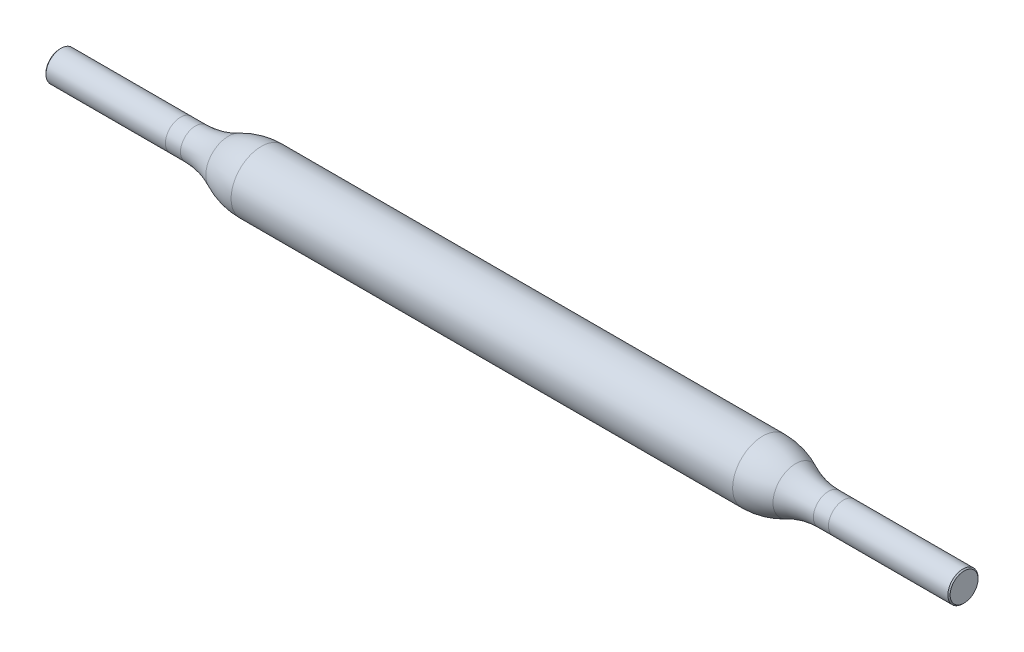
ISO-10303-21;
HEADER;
FILE_DESCRIPTION(('STEP AP214'),'2;1');
FILE_NAME('part.step','',(''),(''),'','','');
FILE_SCHEMA(('AUTOMOTIVE_DESIGN { 1 0 10303 214 1 1 1 1 }'));
ENDSEC;
DATA;
#1=APPLICATION_CONTEXT('core data for automotive mechanical design processes');
#2=APPLICATION_PROTOCOL_DEFINITION('international standard','automotive_design',2000,#1);
#3=PRODUCT_CONTEXT('',#1,'mechanical');
#4=PRODUCT('Part','Part','',(#3));
#5=PRODUCT_RELATED_PRODUCT_CATEGORY('part','',(#4));
#6=PRODUCT_DEFINITION_FORMATION('','',#4);
#7=PRODUCT_DEFINITION_CONTEXT('part definition',#1,'design');
#8=PRODUCT_DEFINITION('design','',#6,#7);
#9=PRODUCT_DEFINITION_SHAPE('','',#8);
#10=(LENGTH_UNIT() NAMED_UNIT(*) SI_UNIT(.MILLI.,.METRE.));
#11=(NAMED_UNIT(*) PLANE_ANGLE_UNIT() SI_UNIT($,.RADIAN.));
#12=(NAMED_UNIT(*) SI_UNIT($,.STERADIAN.) SOLID_ANGLE_UNIT());
#13=UNCERTAINTY_MEASURE_WITH_UNIT(LENGTH_MEASURE(1.E-05),#10,'distance_accuracy_value','');
#14=(GEOMETRIC_REPRESENTATION_CONTEXT(3) GLOBAL_UNCERTAINTY_ASSIGNED_CONTEXT((#13)) GLOBAL_UNIT_ASSIGNED_CONTEXT((#10,
#11,#12)) REPRESENTATION_CONTEXT('',''));
#15=CARTESIAN_POINT('',(0.,0.,0.));
#16=DIRECTION('',(0.,0.,1.));
#17=DIRECTION('',(1.,0.,0.));
#18=AXIS2_PLACEMENT_3D('',#15,#16,#17);
#19=CARTESIAN_POINT('',(-30.,0.,0.));
#20=DIRECTION('',(-1.,0.,0.));
#21=DIRECTION('',(0.,0.,1.));
#22=AXIS2_PLACEMENT_3D('',#19,#20,#21);
#23=CYLINDRICAL_SURFACE('',#22,1.);
#24=CARTESIAN_POINT('',(21.,0.,0.));
#25=DIRECTION('',(-1.,0.,0.));
#26=DIRECTION('',(0.,0.,1.));
#27=AXIS2_PLACEMENT_3D('',#24,#25,#26);
#28=CIRCLE('',#27,1.);
#29=CARTESIAN_POINT('',(21.,0.,1.));
#30=VERTEX_POINT('',#29);
#31=EDGE_CURVE('E74',#30,#30,#28,.T.);
#32=ORIENTED_EDGE('',*,*,#31,.F.);
#33=EDGE_LOOP('',(#32));
#34=FACE_BOUND('',#33,.T.);
#35=CARTESIAN_POINT('',(22.,0.,0.));
#36=DIRECTION('',(1.,0.,0.));
#37=DIRECTION('',(0.,0.,-1.));
#38=AXIS2_PLACEMENT_3D('',#35,#36,#37);
#39=CIRCLE('',#38,1.);
#40=CARTESIAN_POINT('',(22.,0.,-1.));
#41=VERTEX_POINT('',#40);
#42=EDGE_CURVE('E66',#41,#41,#39,.T.);
#43=ORIENTED_EDGE('',*,*,#42,.F.);
#44=EDGE_LOOP('',(#43));
#45=FACE_BOUND('',#44,.T.);
#46=ADVANCED_FACE('F45',(#34,#45),#23,.T.);
#47=CARTESIAN_POINT('',(-30.,0.,0.));
#48=DIRECTION('',(-1.,0.,0.));
#49=DIRECTION('',(0.,0.,1.));
#50=AXIS2_PLACEMENT_3D('',#47,#48,#49);
#51=CYLINDRICAL_SURFACE('',#50,1.);
#52=CARTESIAN_POINT('',(-29.925,0.,0.));
#53=DIRECTION('',(1.,0.,0.));
#54=DIRECTION('',(0.,0.,-1.));
#55=AXIS2_PLACEMENT_3D('',#52,#53,#54);
#56=CIRCLE('',#55,1.);
#57=CARTESIAN_POINT('',(-29.925,0.,-1.));
#58=VERTEX_POINT('',#57);
#59=EDGE_CURVE('E57',#58,#58,#56,.T.);
#60=ORIENTED_EDGE('',*,*,#59,.T.);
#61=EDGE_LOOP('',(#60));
#62=FACE_BOUND('',#61,.T.);
#63=CARTESIAN_POINT('',(-22.,0.,0.));
#64=DIRECTION('',(1.,0.,0.));
#65=DIRECTION('',(0.,0.,-1.));
#66=AXIS2_PLACEMENT_3D('',#63,#64,#65);
#67=CIRCLE('',#66,1.);
#68=CARTESIAN_POINT('',(-22.,0.,-1.));
#69=VERTEX_POINT('',#68);
#70=EDGE_CURVE('E70',#69,#69,#67,.T.);
#71=ORIENTED_EDGE('',*,*,#70,.F.);
#72=EDGE_LOOP('',(#71));
#73=FACE_BOUND('',#72,.T.);
#74=ADVANCED_FACE('F128',(#62,#73),#51,.T.);
#75=CARTESIAN_POINT('',(-30.,0.,0.));
#76=DIRECTION('',(1.,0.,0.));
#77=DIRECTION('',(0.,0.,-1.));
#78=AXIS2_PLACEMENT_3D('',#75,#76,#77);
#79=PLANE('',#78);
#80=CARTESIAN_POINT('',(-30.,0.,0.));
#81=DIRECTION('',(1.,0.,0.));
#82=DIRECTION('',(0.,0.,-1.));
#83=AXIS2_PLACEMENT_3D('',#80,#81,#82);
#84=CIRCLE('',#83,0.924999999999995);
#85=CARTESIAN_POINT('',(-30.,0.,-0.924999999999995));
#86=VERTEX_POINT('',#85);
#87=EDGE_CURVE('E61',#86,#86,#84,.F.);
#88=ORIENTED_EDGE('',*,*,#87,.T.);
#89=EDGE_LOOP('',(#88));
#90=FACE_BOUND('',#89,.T.);
#91=ADVANCED_FACE('F137',(#90),#79,.F.);
#92=CARTESIAN_POINT('',(30.,0.,0.));
#93=DIRECTION('',(-1.,0.,0.));
#94=DIRECTION('',(0.,0.,1.));
#95=AXIS2_PLACEMENT_3D('',#92,#93,#94);
#96=PLANE('',#95);
#97=CARTESIAN_POINT('',(30.,0.,0.));
#98=DIRECTION('',(-1.,0.,0.));
#99=DIRECTION('',(0.,0.,1.));
#100=AXIS2_PLACEMENT_3D('',#97,#98,#99);
#101=CIRCLE('',#100,0.925000000000002);
#102=CARTESIAN_POINT('',(30.,0.,0.925000000000002));
#103=VERTEX_POINT('',#102);
#104=EDGE_CURVE('E10',#103,#103,#101,.F.);
#105=ORIENTED_EDGE('',*,*,#104,.T.);
#106=EDGE_LOOP('',(#105));
#107=FACE_BOUND('',#106,.T.);
#108=ADVANCED_FACE('F133',(#107),#96,.F.);
#109=CARTESIAN_POINT('',(29.925,0.,0.));
#110=DIRECTION('',(-1.,0.,0.));
#111=DIRECTION('',(0.,0.,1.));
#112=AXIS2_PLACEMENT_3D('',#109,#110,#111);
#113=CIRCLE('',#112,1.);
#114=CARTESIAN_POINT('',(29.925,0.,1.));
#115=VERTEX_POINT('',#114);
#116=EDGE_CURVE('E53',#115,#115,#113,.T.);
#117=ORIENTED_EDGE('',*,*,#116,.T.);
#118=EDGE_LOOP('',(#117));
#119=FACE_BOUND('',#118,.T.);
#120=ORIENTED_EDGE('',*,*,#42,.T.);
#121=EDGE_LOOP('',(#120));
#122=FACE_BOUND('',#121,.T.);
#123=ADVANCED_FACE('F122',(#119,#122),#23,.T.);
#124=CARTESIAN_POINT('',(21.,0.,0.));
#125=DIRECTION('',(-1.,0.,0.));
#126=DIRECTION('',(0.,0.,1.));
#127=AXIS2_PLACEMENT_3D('',#124,#125,#126);
#128=TOROIDAL_SURFACE('',#127,6.,5.);
#129=CARTESIAN_POINT('',(18.8205505282297,0.,0.));
#130=DIRECTION('',(-1.,0.,0.));
#131=DIRECTION('',(0.,0.,1.));
#132=AXIS2_PLACEMENT_3D('',#129,#130,#131);
#133=CIRCLE('',#132,1.5);
#134=CARTESIAN_POINT('',(18.8205505282297,0.,1.5));
#135=VERTEX_POINT('',#134);
#136=EDGE_CURVE('E77',#135,#135,#133,.T.);
#137=ORIENTED_EDGE('',*,*,#136,.F.);
#138=EDGE_LOOP('',(#137));
#139=FACE_BOUND('',#138,.T.);
#140=ORIENTED_EDGE('',*,*,#31,.T.);
#141=EDGE_LOOP('',(#140));
#142=FACE_BOUND('',#141,.T.);
#143=ADVANCED_FACE('F116',(#139,#142),#128,.F.);
#144=CARTESIAN_POINT('',(16.6411010564593,0.,0.));
#145=DIRECTION('',(-1.,0.,0.));
#146=DIRECTION('',(0.,0.,1.));
#147=AXIS2_PLACEMENT_3D('',#144,#145,#146);
#148=DEGENERATE_TOROIDAL_SURFACE('',#147,3.,5.,.F.);
#149=CARTESIAN_POINT('',(16.6411010564593,0.,0.));
#150=DIRECTION('',(-1.,0.,0.));
#151=DIRECTION('',(0.,0.,1.));
#152=AXIS2_PLACEMENT_3D('',#149,#150,#151);
#153=CIRCLE('',#152,2.);
#154=CARTESIAN_POINT('',(16.6411010564593,0.,2.));
#155=VERTEX_POINT('',#154);
#156=EDGE_CURVE('E80',#155,#155,#153,.T.);
#157=ORIENTED_EDGE('',*,*,#156,.F.);
#158=EDGE_LOOP('',(#157));
#159=FACE_BOUND('',#158,.T.);
#160=ORIENTED_EDGE('',*,*,#136,.T.);
#161=EDGE_LOOP('',(#160));
#162=FACE_BOUND('',#161,.T.);
#163=ADVANCED_FACE('F110',(#159,#162),#148,.F.);
#164=CARTESIAN_POINT('',(-30.,0.,0.));
#165=DIRECTION('',(-1.,0.,0.));
#166=DIRECTION('',(0.,0.,1.));
#167=AXIS2_PLACEMENT_3D('',#164,#165,#166);
#168=CYLINDRICAL_SURFACE('',#167,2.);
#169=CARTESIAN_POINT('',(-16.6411010564593,0.,0.));
#170=DIRECTION('',(-1.,0.,0.));
#171=DIRECTION('',(0.,0.,1.));
#172=AXIS2_PLACEMENT_3D('',#169,#170,#171);
#173=CIRCLE('',#172,2.);
#174=CARTESIAN_POINT('',(-16.6411010564593,0.,2.));
#175=VERTEX_POINT('',#174);
#176=EDGE_CURVE('E83',#175,#175,#173,.T.);
#177=ORIENTED_EDGE('',*,*,#176,.F.);
#178=EDGE_LOOP('',(#177));
#179=FACE_BOUND('',#178,.T.);
#180=ORIENTED_EDGE('',*,*,#156,.T.);
#181=EDGE_LOOP('',(#180));
#182=FACE_BOUND('',#181,.T.);
#183=ADVANCED_FACE('F104',(#179,#182),#168,.T.);
#184=CARTESIAN_POINT('',(-16.6411010564593,0.,0.));
#185=DIRECTION('',(-1.,0.,0.));
#186=DIRECTION('',(0.,0.,1.));
#187=AXIS2_PLACEMENT_3D('',#184,#185,#186);
#188=DEGENERATE_TOROIDAL_SURFACE('',#187,3.,5.,.F.);
#189=CARTESIAN_POINT('',(-18.8205505282297,0.,0.));
#190=DIRECTION('',(-1.,0.,0.));
#191=DIRECTION('',(0.,0.,1.));
#192=AXIS2_PLACEMENT_3D('',#189,#190,#191);
#193=CIRCLE('',#192,1.5);
#194=CARTESIAN_POINT('',(-18.8205505282297,0.,1.5));
#195=VERTEX_POINT('',#194);
#196=EDGE_CURVE('E86',#195,#195,#193,.T.);
#197=ORIENTED_EDGE('',*,*,#196,.F.);
#198=EDGE_LOOP('',(#197));
#199=FACE_BOUND('',#198,.T.);
#200=ORIENTED_EDGE('',*,*,#176,.T.);
#201=EDGE_LOOP('',(#200));
#202=FACE_BOUND('',#201,.T.);
#203=ADVANCED_FACE('F98',(#199,#202),#188,.F.);
#204=CARTESIAN_POINT('',(-21.,0.,0.));
#205=DIRECTION('',(-1.,0.,0.));
#206=DIRECTION('',(0.,0.,1.));
#207=AXIS2_PLACEMENT_3D('',#204,#205,#206);
#208=TOROIDAL_SURFACE('',#207,6.,5.);
#209=CARTESIAN_POINT('',(-21.,0.,0.));
#210=DIRECTION('',(-1.,0.,0.));
#211=DIRECTION('',(0.,0.,1.));
#212=AXIS2_PLACEMENT_3D('',#209,#210,#211);
#213=CIRCLE('',#212,1.);
#214=CARTESIAN_POINT('',(-21.,0.,1.));
#215=VERTEX_POINT('',#214);
#216=EDGE_CURVE('E89',#215,#215,#213,.T.);
#217=ORIENTED_EDGE('',*,*,#216,.F.);
#218=EDGE_LOOP('',(#217));
#219=FACE_BOUND('',#218,.T.);
#220=ORIENTED_EDGE('',*,*,#196,.T.);
#221=EDGE_LOOP('',(#220));
#222=FACE_BOUND('',#221,.T.);
#223=ADVANCED_FACE('F95',(#219,#222),#208,.F.);
#224=ORIENTED_EDGE('',*,*,#70,.T.);
#225=EDGE_LOOP('',(#224));
#226=FACE_BOUND('',#225,.T.);
#227=ORIENTED_EDGE('',*,*,#216,.T.);
#228=EDGE_LOOP('',(#227));
#229=FACE_BOUND('',#228,.T.);
#230=ADVANCED_FACE('F93',(#226,#229),#51,.T.);
#231=CARTESIAN_POINT('',(-30.,0.,0.));
#232=DIRECTION('',(1.,0.,0.));
#233=DIRECTION('',(0.,0.,-1.));
#234=AXIS2_PLACEMENT_3D('',#231,#232,#233);
#235=CONICAL_SURFACE('',#234,0.924999999999995,0.785398163397492);
#236=ORIENTED_EDGE('',*,*,#59,.F.);
#237=EDGE_LOOP('',(#236));
#238=FACE_BOUND('',#237,.T.);
#239=ORIENTED_EDGE('',*,*,#87,.F.);
#240=EDGE_LOOP('',(#239));
#241=FACE_BOUND('',#240,.T.);
#242=ADVANCED_FACE('F143',(#238,#241),#235,.T.);
#243=CARTESIAN_POINT('',(29.925,0.,0.));
#244=DIRECTION('',(-1.,0.,0.));
#245=DIRECTION('',(0.,0.,1.));
#246=AXIS2_PLACEMENT_3D('',#243,#244,#245);
#247=CONICAL_SURFACE('',#246,1.,0.78539816339746);
#248=ORIENTED_EDGE('',*,*,#104,.F.);
#249=EDGE_LOOP('',(#248));
#250=FACE_BOUND('',#249,.T.);
#251=ORIENTED_EDGE('',*,*,#116,.F.);
#252=EDGE_LOOP('',(#251));
#253=FACE_BOUND('',#252,.T.);
#254=ADVANCED_FACE('F48',(#250,#253),#247,.T.);
#255=CLOSED_SHELL('',(#46,#74,#91,#108,#123,#143,#163,#183,#203,#223,#230,#242,#254));
#256=MANIFOLD_SOLID_BREP('B2',#255);
#257=ADVANCED_BREP_SHAPE_REPRESENTATION('',(#18,#256),#14);
#258=SHAPE_DEFINITION_REPRESENTATION(#9,#257);
ENDSEC;
END-ISO-10303-21;
